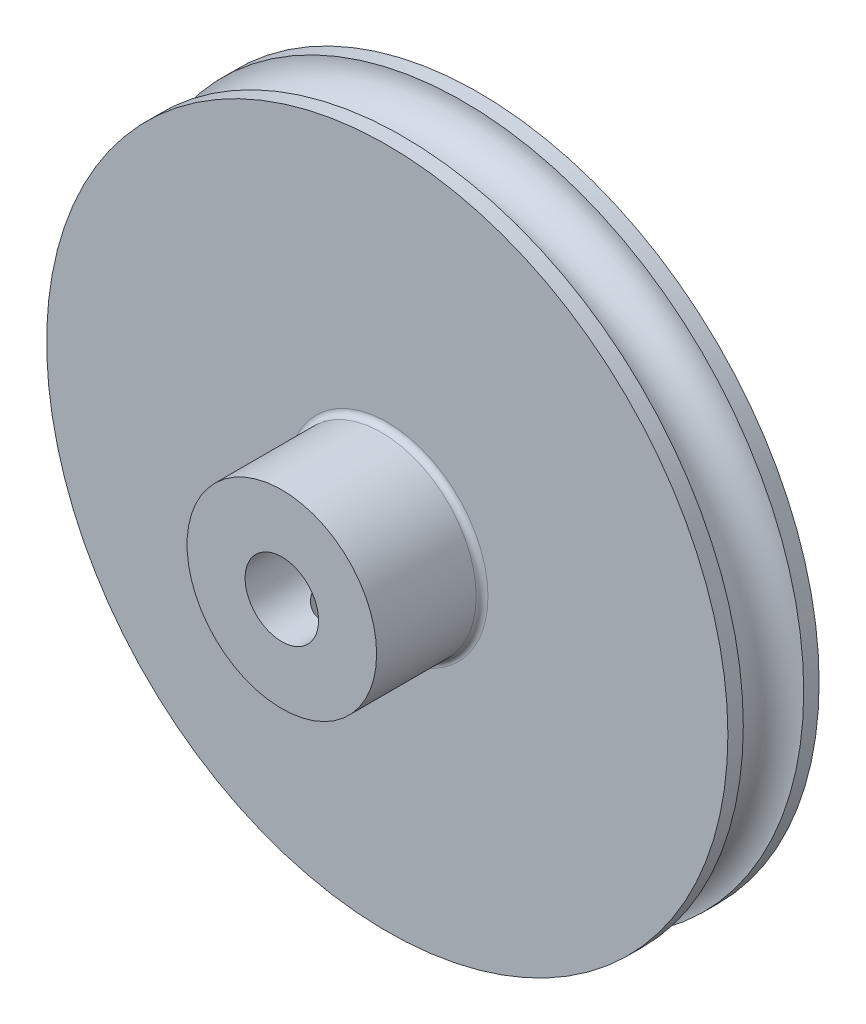
ISO-10303-21;
HEADER;
FILE_DESCRIPTION(('STEP AP214'),'2;1');
FILE_NAME('part.step','',(''),(''),'','','');
FILE_SCHEMA(('AUTOMOTIVE_DESIGN { 1 0 10303 214 1 1 1 1 }'));
ENDSEC;
DATA;
#1=APPLICATION_CONTEXT('core data for automotive mechanical design processes');
#2=APPLICATION_PROTOCOL_DEFINITION('international standard','automotive_design',2000,#1);
#3=PRODUCT_CONTEXT('',#1,'mechanical');
#4=PRODUCT('Part','Part','',(#3));
#5=PRODUCT_RELATED_PRODUCT_CATEGORY('part','',(#4));
#6=PRODUCT_DEFINITION_FORMATION('','',#4);
#7=PRODUCT_DEFINITION_CONTEXT('part definition',#1,'design');
#8=PRODUCT_DEFINITION('design','',#6,#7);
#9=PRODUCT_DEFINITION_SHAPE('','',#8);
#10=(LENGTH_UNIT() NAMED_UNIT(*) SI_UNIT(.MILLI.,.METRE.));
#11=(NAMED_UNIT(*) PLANE_ANGLE_UNIT() SI_UNIT($,.RADIAN.));
#12=(NAMED_UNIT(*) SI_UNIT($,.STERADIAN.) SOLID_ANGLE_UNIT());
#13=UNCERTAINTY_MEASURE_WITH_UNIT(LENGTH_MEASURE(1.E-05),#10,'distance_accuracy_value','');
#14=(GEOMETRIC_REPRESENTATION_CONTEXT(3) GLOBAL_UNCERTAINTY_ASSIGNED_CONTEXT((#13)) GLOBAL_UNIT_ASSIGNED_CONTEXT((#10,
#11,#12)) REPRESENTATION_CONTEXT('',''));
#15=CARTESIAN_POINT('',(0.,0.,0.));
#16=DIRECTION('',(0.,0.,1.));
#17=DIRECTION('',(1.,0.,0.));
#18=AXIS2_PLACEMENT_3D('',#15,#16,#17);
#19=CARTESIAN_POINT('',(0.,0.,3.85));
#20=DIRECTION('',(0.,0.,-1.));
#21=DIRECTION('',(-1.,0.,0.));
#22=AXIS2_PLACEMENT_3D('',#19,#20,#21);
#23=CYLINDRICAL_SURFACE('',#22,28.75);
#24=CARTESIAN_POINT('',(0.,0.,2.55));
#25=DIRECTION('',(0.,0.,-1.));
#26=DIRECTION('',(-1.,0.,0.));
#27=AXIS2_PLACEMENT_3D('',#24,#25,#26);
#28=CIRCLE('',#27,28.75);
#29=CARTESIAN_POINT('',(28.75,0.,2.55));
#30=VERTEX_POINT('',#29);
#31=EDGE_CURVE('E66',#30,#30,#28,.F.);
#32=ORIENTED_EDGE('',*,*,#31,.T.);
#33=EDGE_LOOP('',(#32));
#34=FACE_BOUND('',#33,.T.);
#35=CARTESIAN_POINT('',(0.,0.,3.85));
#36=DIRECTION('',(0.,0.,1.));
#37=DIRECTION('',(1.,0.,0.));
#38=AXIS2_PLACEMENT_3D('',#35,#36,#37);
#39=CIRCLE('',#38,28.75);
#40=CARTESIAN_POINT('',(28.75,0.,3.85));
#41=VERTEX_POINT('',#40);
#42=EDGE_CURVE('E74',#41,#41,#39,.T.);
#43=ORIENTED_EDGE('',*,*,#42,.F.);
#44=EDGE_LOOP('',(#43));
#45=FACE_BOUND('',#44,.T.);
#46=ADVANCED_FACE('F45',(#34,#45),#23,.T.);
#47=CARTESIAN_POINT('',(0.,0.,3.85));
#48=DIRECTION('',(0.,0.,1.));
#49=DIRECTION('',(1.,0.,0.));
#50=AXIS2_PLACEMENT_3D('',#47,#48,#49);
#51=PLANE('',#50);
#52=CARTESIAN_POINT('',(0.,0.,3.85));
#53=DIRECTION('',(0.,0.,1.));
#54=DIRECTION('',(1.,0.,0.));
#55=AXIS2_PLACEMENT_3D('',#52,#53,#54);
#56=CIRCLE('',#55,8.5);
#57=CARTESIAN_POINT('',(8.5,0.,3.85));
#58=VERTEX_POINT('',#57);
#59=EDGE_CURVE('E12',#58,#58,#56,.F.);
#60=ORIENTED_EDGE('',*,*,#59,.T.);
#61=EDGE_LOOP('',(#60));
#62=FACE_BOUND('',#61,.T.);
#63=ORIENTED_EDGE('',*,*,#42,.T.);
#64=EDGE_LOOP('',(#63));
#65=FACE_BOUND('',#64,.T.);
#66=ADVANCED_FACE('F126',(#62,#65),#51,.T.);
#67=CARTESIAN_POINT('',(0.,0.,0.));
#68=DIRECTION('',(0.,0.,1.));
#69=DIRECTION('',(1.,0.,0.));
#70=AXIS2_PLACEMENT_3D('',#67,#68,#69);
#71=TOROIDAL_SURFACE('',#70,28.75,2.55);
#72=CARTESIAN_POINT('',(28.75,0.,0.));
#73=DIRECTION('',(0.,1.,0.));
#74=DIRECTION('',(0.,0.,1.));
#75=AXIS2_PLACEMENT_3D('',#72,#73,#74);
#76=CIRCLE('',#75,2.55);
#77=CARTESIAN_POINT('',(28.75,0.,-2.55));
#78=VERTEX_POINT('',#77);
#79=EDGE_CURVE('E61',#78,#30,#76,.T.);
#80=ORIENTED_EDGE('',*,*,#79,.F.);
#81=CARTESIAN_POINT('',(0.,0.,-2.55));
#82=DIRECTION('',(0.,0.,1.));
#83=DIRECTION('',(1.,0.,0.));
#84=AXIS2_PLACEMENT_3D('',#81,#82,#83);
#85=CIRCLE('',#84,28.75);
#86=EDGE_CURVE('E64',#78,#78,#85,.F.);
#87=ORIENTED_EDGE('',*,*,#86,.F.);
#88=ORIENTED_EDGE('',*,*,#79,.T.);
#89=ORIENTED_EDGE('',*,*,#31,.F.);
#90=EDGE_LOOP('',(#80,#87,#88,#89));
#91=FACE_BOUND('',#90,.T.);
#92=ADVANCED_FACE('F62',(#91),#71,.F.);
#93=CARTESIAN_POINT('',(0.,0.,-3.85));
#94=DIRECTION('',(0.,0.,1.));
#95=DIRECTION('',(1.,0.,0.));
#96=AXIS2_PLACEMENT_3D('',#93,#94,#95);
#97=PLANE('',#96);
#98=CARTESIAN_POINT('',(0.,0.,-3.85));
#99=DIRECTION('',(0.,0.,1.));
#100=DIRECTION('',(1.,0.,0.));
#101=AXIS2_PLACEMENT_3D('',#98,#99,#100);
#102=CIRCLE('',#101,28.75);
#103=CARTESIAN_POINT('',(28.75,0.,-3.85));
#104=VERTEX_POINT('',#103);
#105=EDGE_CURVE('E68',#104,#104,#102,.T.);
#106=ORIENTED_EDGE('',*,*,#105,.F.);
#107=EDGE_LOOP('',(#106));
#108=FACE_BOUND('',#107,.T.);
#109=ADVANCED_FACE('F125',(#108),#97,.F.);
#110=ORIENTED_EDGE('',*,*,#86,.T.);
#111=EDGE_LOOP('',(#110));
#112=FACE_BOUND('',#111,.T.);
#113=ORIENTED_EDGE('',*,*,#105,.T.);
#114=EDGE_LOOP('',(#113));
#115=FACE_BOUND('',#114,.T.);
#116=ADVANCED_FACE('F121',(#112,#115),#23,.T.);
#117=CARTESIAN_POINT('',(0.,0.,12.75));
#118=DIRECTION('',(0.,0.,-1.));
#119=DIRECTION('',(-1.,0.,0.));
#120=AXIS2_PLACEMENT_3D('',#117,#118,#119);
#121=CYLINDRICAL_SURFACE('',#120,8.);
#122=CARTESIAN_POINT('',(0.,0.,4.35));
#123=DIRECTION('',(0.,0.,1.));
#124=DIRECTION('',(1.,0.,0.));
#125=AXIS2_PLACEMENT_3D('',#122,#123,#124);
#126=CIRCLE('',#125,8.);
#127=CARTESIAN_POINT('',(8.,0.,4.35));
#128=VERTEX_POINT('',#127);
#129=EDGE_CURVE('E54',#128,#128,#126,.T.);
#130=ORIENTED_EDGE('',*,*,#129,.T.);
#131=EDGE_LOOP('',(#130));
#132=FACE_BOUND('',#131,.T.);
#133=CARTESIAN_POINT('',(0.,-8.,9.5));
#134=CARTESIAN_POINT('',(0.110501451559641,-7.9999981315735,9.49999689901579));
#135=CARTESIAN_POINT('',(0.221037543774351,-7.99768770842435,9.49081126563495));
#136=CARTESIAN_POINT('',(0.438941765027377,-7.98869485106526,9.45436646492399));
#137=CARTESIAN_POINT('',(0.546308062494319,-7.98200993893301,9.42709705394953));
#138=CARTESIAN_POINT('',(0.754694496243435,-7.96500835109376,9.35541432871722));
#139=CARTESIAN_POINT('',(0.855722084573336,-7.95469603789411,9.31102160171297));
#140=CARTESIAN_POINT('',(1.04889617587257,-7.93153791743495,9.20642481327354));
#141=CARTESIAN_POINT('',(1.14104237913168,-7.91869202472209,9.14622021850805));
#142=CARTESIAN_POINT('',(1.31573590306789,-7.89156551455591,9.01039894712776));
#143=CARTESIAN_POINT('',(1.39807425341474,-7.87726276197502,8.93451790005459));
#144=CARTESIAN_POINT('',(1.54899856960443,-7.84898160157248,8.77006372678795));
#145=CARTESIAN_POINT('',(1.61758298259892,-7.83500323053157,8.68148916940408));
#146=CARTESIAN_POINT('',(1.74003539039863,-7.80873034264225,8.49253969768401));
#147=CARTESIAN_POINT('',(1.79366962123352,-7.79646392619748,8.39200902558836));
#148=CARTESIAN_POINT('',(1.88319587806766,-7.77532659757355,8.18300211778662));
#149=CARTESIAN_POINT('',(1.91909074058685,-7.76645514259225,8.07452715555731));
#150=CARTESIAN_POINT('',(1.97140644907302,-7.7533396892843,7.85500866906446));
#151=CARTESIAN_POINT('',(1.98820302444274,-7.74900654662681,7.74406013861601));
#152=CARTESIAN_POINT('',(2.00301570008854,-7.74519149946122,7.52084190800087));
#153=CARTESIAN_POINT('',(2.00103485575748,-7.74570880570571,7.40857242574382));
#154=CARTESIAN_POINT('',(1.97864869951961,-7.75145607355756,7.1887789230062));
#155=CARTESIAN_POINT('',(1.95869112025418,-7.75657150676391,7.08120583804623));
#156=CARTESIAN_POINT('',(1.90163224920399,-7.77075612894758,6.87098526545192));
#157=CARTESIAN_POINT('',(1.86452973609252,-7.77982559958985,6.76833812929477));
#158=CARTESIAN_POINT('',(1.77385263724958,-7.80100151874212,6.56968264499716));
#159=CARTESIAN_POINT('',(1.72011555631056,-7.81313769959755,6.47375177094724));
#160=CARTESIAN_POINT('',(1.59780836801993,-7.83906281127988,6.29210838699091));
#161=CARTESIAN_POINT('',(1.52923566507845,-7.85285203112837,6.20639766924367));
#162=CARTESIAN_POINT('',(1.37688456624163,-7.88101174053188,6.04506184574079));
#163=CARTESIAN_POINT('',(1.29272834422115,-7.89538759304001,5.96979401325153));
#164=CARTESIAN_POINT('',(1.11281589000493,-7.92274620771675,5.8343716767148));
#165=CARTESIAN_POINT('',(1.01705930361059,-7.93572892732543,5.77421763431525));
#166=CARTESIAN_POINT('',(0.816154518241855,-7.9589030945892,5.67059921836749));
#167=CARTESIAN_POINT('',(0.710975190944831,-7.96908480170303,5.62719287966076));
#168=CARTESIAN_POINT('',(0.49450134419051,-7.98543889321888,5.55877692572057));
#169=CARTESIAN_POINT('',(0.383207998867312,-7.99161204452374,5.53376379144248));
#170=CARTESIAN_POINT('',(0.160719960520035,-7.999139990285,5.50338991258822));
#171=CARTESIAN_POINT('',(0.0495956266509452,-8.00061404677705,5.4975426318996));
#172=CARTESIAN_POINT('',(-0.172043833068678,-7.99891739752601,5.50433200274065));
#173=CARTESIAN_POINT('',(-0.282559012859461,-7.99574710989128,5.51696699039884));
#174=CARTESIAN_POINT('',(-0.498152358368656,-7.98519441503143,5.55996121118851));
#175=CARTESIAN_POINT('',(-0.603286825291673,-7.97787512247748,5.59005501796932));
#176=CARTESIAN_POINT('',(-0.807009723270016,-7.95984942178845,5.66680944537126));
#177=CARTESIAN_POINT('',(-0.905597492043513,-7.94914267159856,5.71347173908423));
#178=CARTESIAN_POINT('',(-1.0953641792398,-7.92524410568414,5.82298150516631));
#179=CARTESIAN_POINT('',(-1.18638058911444,-7.91201156489243,5.88610148319569));
#180=CARTESIAN_POINT('',(-1.35670215152433,-7.88459345583226,6.02638654506263));
#181=CARTESIAN_POINT('',(-1.43600527863068,-7.87040772335606,6.10355405282254));
#182=CARTESIAN_POINT('',(-1.58265409076364,-7.84225275947695,6.27200261445929));
#183=CARTESIAN_POINT('',(-1.64965849016271,-7.82829738916375,6.36358360400323));
#184=CARTESIAN_POINT('',(-1.7673476786836,-7.80257171169652,6.55697684595429));
#185=CARTESIAN_POINT('',(-1.81803319221058,-7.79080130756035,6.65878864394634));
#186=CARTESIAN_POINT('',(-1.90126856081239,-7.77090792979553,6.86920762988411));
#187=CARTESIAN_POINT('',(-1.93392586220542,-7.76276340389207,6.97777017112535));
#188=CARTESIAN_POINT('',(-1.98046087993837,-7.75102325453578,7.19907951718548));
#189=CARTESIAN_POINT('',(-1.99434270330488,-7.74742663626581,7.31182540137666));
#190=CARTESIAN_POINT('',(-2.00271812044533,-7.74526534938609,7.53482803180694));
#191=CARTESIAN_POINT('',(-1.99775719704016,-7.74655910304352,7.64506324683298));
#192=CARTESIAN_POINT('',(-1.96983637108382,-7.7537054534379,7.86307185155731));
#193=CARTESIAN_POINT('',(-1.94687683024903,-7.75955795855809,7.97084529068487));
#194=CARTESIAN_POINT('',(-1.88390842592373,-7.77508347576963,8.18027794542055));
#195=CARTESIAN_POINT('',(-1.84400187290717,-7.78473353648412,8.28196974032028));
#196=CARTESIAN_POINT('',(-1.74835321814009,-7.80677007633105,8.47728717695159));
#197=CARTESIAN_POINT('',(-1.69260892004558,-7.81915693494364,8.57091169758256));
#198=CARTESIAN_POINT('',(-1.56515699818285,-7.8456751235135,8.75007283866936));
#199=CARTESIAN_POINT('',(-1.493070883883,-7.85984353109009,8.83533476456528));
#200=CARTESIAN_POINT('',(-1.33571916158631,-7.88810702995048,8.99272939306054));
#201=CARTESIAN_POINT('',(-1.25045042834819,-7.90220210302746,9.06485897348396));
#202=CARTESIAN_POINT('',(-1.06729011560345,-7.92903540863551,9.19521507808614));
#203=CARTESIAN_POINT('',(-0.969197896421848,-7.94174444487824,9.25316615156211));
#204=CARTESIAN_POINT('',(-0.764354746013967,-7.96406566633491,9.35166328392071));
#205=CARTESIAN_POINT('',(-0.657610084582319,-7.97368006933042,9.39222181419805));
#206=CARTESIAN_POINT('',(-0.459213670991295,-7.98730746087389,9.44876244043954));
#207=CARTESIAN_POINT('',(-0.368506894544092,-7.9920344673692,9.46793499073791));
#208=CARTESIAN_POINT('',(-0.185208095381711,-7.99838140309264,9.49355459149592));
#209=CARTESIAN_POINT('',(-0.0926162149901552,-8.00000156601192,9.50000259907373));
#210=CARTESIAN_POINT('',(0.,-8.,9.5));
#211=B_SPLINE_CURVE_WITH_KNOTS('',3,(#133,#134,#135,#136,#137,#138,#139,#140,#141,#142,#143,
#144,#145,#146,#147,#148,#149,#150,#151,#152,#153,#154,#155,#156,#157,#158,#159,#160,#161,#162,
#163,#164,#165,#166,#167,#168,#169,#170,#171,#172,#173,#174,#175,#176,#177,#178,#179,#180,#181,
#182,#183,#184,#185,#186,#187,#188,#189,#190,#191,#192,#193,#194,#195,#196,#197,#198,#199,#200,
#201,#202,#203,#204,#205,#206,#207,#208,#209,#210),.UNSPECIFIED.,.T.,.F.,(4,2,2,2,2,2,2,2,2,2,2,
2,2,2,2,2,2,2,2,2,2,2,2,2,2,2,2,2,2,2,2,2,2,2,2,2,2,2,4),(0.,0.331164949962519,
0.662517650351866,0.993473203048141,1.32443992022577,1.66152580582852,1.99864972773416,
2.34078196727742,2.68285948225824,3.01808393468093,3.3532538415469,3.68029996013785,
4.00736937959146,4.337740371696,4.66816921119311,5.00802001296453,5.34788119415424,
5.6889097201658,6.02987298255951,6.36211078603463,6.69431868154752,7.02160366023144,
7.34892169767482,7.68204783424897,8.01523150681786,8.35659345610396,8.69794025003772,
9.03723006156476,9.37644564340971,9.70591707202578,10.0353818794581,10.3628853408369,
10.6904342418696,11.0265276855097,11.3627009303165,11.7049624733721,12.0469781843289,
12.3245632392729,12.6021274139515),.UNSPECIFIED.);
#212=CARTESIAN_POINT('',(0.,-8.,9.5));
#213=VERTEX_POINT('',#212);
#214=EDGE_CURVE('E96',#213,#213,#211,.T.);
#215=ORIENTED_EDGE('',*,*,#214,.T.);
#216=EDGE_LOOP('',(#215));
#217=FACE_BOUND('',#216,.T.);
#218=CARTESIAN_POINT('',(0.,0.,12.75));
#219=DIRECTION('',(0.,0.,1.));
#220=DIRECTION('',(1.,0.,0.));
#221=AXIS2_PLACEMENT_3D('',#218,#219,#220);
#222=CIRCLE('',#221,8.);
#223=CARTESIAN_POINT('',(8.,0.,12.75));
#224=VERTEX_POINT('',#223);
#225=EDGE_CURVE('E69',#224,#224,#222,.T.);
#226=ORIENTED_EDGE('',*,*,#225,.F.);
#227=EDGE_LOOP('',(#226));
#228=FACE_BOUND('',#227,.T.);
#229=ADVANCED_FACE('F116',(#132,#217,#228),#121,.T.);
#230=CARTESIAN_POINT('',(0.,0.,12.75));
#231=DIRECTION('',(0.,0.,1.));
#232=DIRECTION('',(1.,0.,0.));
#233=AXIS2_PLACEMENT_3D('',#230,#231,#232);
#234=PLANE('',#233);
#235=CARTESIAN_POINT('',(0.,0.,12.75));
#236=DIRECTION('',(0.,0.,1.));
#237=DIRECTION('',(1.,0.,0.));
#238=AXIS2_PLACEMENT_3D('',#235,#236,#237);
#239=CIRCLE('',#238,3.1);
#240=CARTESIAN_POINT('',(3.1,0.,12.75));
#241=VERTEX_POINT('',#240);
#242=EDGE_CURVE('E115',#241,#241,#239,.T.);
#243=ORIENTED_EDGE('',*,*,#242,.F.);
#244=EDGE_LOOP('',(#243));
#245=FACE_BOUND('',#244,.T.);
#246=ORIENTED_EDGE('',*,*,#225,.T.);
#247=EDGE_LOOP('',(#246));
#248=FACE_BOUND('',#247,.T.);
#249=ADVANCED_FACE('F120',(#245,#248),#234,.T.);
#250=CARTESIAN_POINT('',(0.,0.,-12.6181240867132));
#251=DIRECTION('',(0.,0.,1.));
#252=DIRECTION('',(1.,0.,0.));
#253=AXIS2_PLACEMENT_3D('',#250,#251,#252);
#254=CYLINDRICAL_SURFACE('',#253,3.1);
#255=CARTESIAN_POINT('',(0.,-3.1,9.5));
#256=CARTESIAN_POINT('',(-0.101091385039777,-3.09999460939274,9.49999423985456));
#257=CARTESIAN_POINT('',(-0.202236134564494,-3.09500777365122,9.49228861003426));
#258=CARTESIAN_POINT('',(-0.40134422219677,-3.07554251080367,9.46191052513201));
#259=CARTESIAN_POINT('',(-0.499304337672782,-3.0610547651011,9.43922337585951));
#260=CARTESIAN_POINT('',(-0.688847609969658,-3.02403316266577,9.38023929755381));
#261=CARTESIAN_POINT('',(-0.780458562332545,-3.00153742435718,9.34400680467486));
#262=CARTESIAN_POINT('',(-0.955964244967446,-2.95033924070804,9.25944096599089));
#263=CARTESIAN_POINT('',(-1.03985843062382,-2.9216363577727,9.21110676699504));
#264=CARTESIAN_POINT('',(-1.20534975085783,-2.85755815418126,9.09934687867213));
#265=CARTESIAN_POINT('',(-1.28618869122808,-2.82182799524603,9.0350061395549));
#266=CARTESIAN_POINT('',(-1.43665631544782,-2.74828108070154,8.89520120954714));
#267=CARTESIAN_POINT('',(-1.50626924383573,-2.71046149080006,8.81972166508535));
#268=CARTESIAN_POINT('',(-1.64268679943019,-2.63034253686168,8.64691651791072));
#269=CARTESIAN_POINT('',(-1.70759476074744,-2.58819607847858,8.54801033709484));
#270=CARTESIAN_POINT('',(-1.81972592440112,-2.51062817225813,8.33825819113032));
#271=CARTESIAN_POINT('',(-1.86697956402236,-2.47519520238284,8.2274332037925));
#272=CARTESIAN_POINT('',(-1.93115046035712,-2.42525032881529,8.02768249145855));
#273=CARTESIAN_POINT('',(-1.95283049983355,-2.40766682164749,7.94106125555081));
#274=CARTESIAN_POINT('',(-1.98446592184547,-2.38166474413427,7.76441515405156));
#275=CARTESIAN_POINT('',(-1.99443957013961,-2.37323189735386,7.67439581776609));
#276=CARTESIAN_POINT('',(-2.00204983941226,-2.36681793758445,7.49315258210891));
#277=CARTESIAN_POINT('',(-1.99964615392167,-2.36887097141953,7.4019257134594));
#278=CARTESIAN_POINT('',(-1.98258006769263,-2.38316799120796,7.2214121827045));
#279=CARTESIAN_POINT('',(-1.96790747526994,-2.39542044970509,7.13212719699272));
#280=CARTESIAN_POINT('',(-1.92786567346179,-2.42774793365928,6.9607019055138));
#281=CARTESIAN_POINT('',(-1.9028579256027,-2.44755702424853,6.87842389978763));
#282=CARTESIAN_POINT('',(-1.84321796757953,-2.49277853296268,6.71910848586362));
#283=CARTESIAN_POINT('',(-1.80858257660194,-2.51819280237145,6.64207282013664));
#284=CARTESIAN_POINT('',(-1.72290696910724,-2.5777531470504,6.47940367147485));
#285=CARTESIAN_POINT('',(-1.66998346799092,-2.61263498659573,6.39503299514242));
#286=CARTESIAN_POINT('',(-1.55262072653794,-2.68404531595956,6.2354053931168));
#287=CARTESIAN_POINT('',(-1.48816769918918,-2.72057573761244,6.16015956168707));
#288=CARTESIAN_POINT('',(-1.33531850150805,-2.79921977867378,6.00641965469216));
#289=CARTESIAN_POINT('',(-1.2446991971314,-2.84108811643832,5.92998603795691));
#290=CARTESIAN_POINT('',(-1.04963410942446,-2.91877600894092,5.79342507092218));
#291=CARTESIAN_POINT('',(-0.945202988602563,-2.95460188779143,5.73328063171092));
#292=CARTESIAN_POINT('',(-0.746639365899209,-3.01014273026213,5.64204748666379));
#293=CARTESIAN_POINT('',(-0.65456737995395,-3.03164347825907,5.6075627187463));
#294=CARTESIAN_POINT('',(-0.464930213104867,-3.06644845105128,5.55229077747468));
#295=CARTESIAN_POINT('',(-0.367369568656605,-3.07975933933833,5.53149246748689));
#296=CARTESIAN_POINT('',(-0.169045410576032,-3.0969921575555,5.50463832866688));
#297=CARTESIAN_POINT('',(-0.0682718516736113,-3.10088094883133,5.49863453267088));
#298=CARTESIAN_POINT('',(0.132930127327373,-3.0987818893615,5.50188808806102));
#299=CARTESIAN_POINT('',(0.233358534619953,-3.09279367603535,5.51114599969775));
#300=CARTESIAN_POINT('',(0.425119290519885,-3.0721423509695,5.54342154508947));
#301=CARTESIAN_POINT('',(0.51664537144639,-3.05798682310753,5.56563483512585));
#302=CARTESIAN_POINT('',(0.694421792387248,-3.02258192723568,5.62210647387215));
#303=CARTESIAN_POINT('',(0.780671246170739,-3.00133137143629,5.65636683945258));
#304=CARTESIAN_POINT('',(0.952313130749649,-2.95155061853353,5.73852436888356));
#305=CARTESIAN_POINT('',(1.03719832856589,-2.92260695610669,5.78722473299525));
#306=CARTESIAN_POINT('',(1.19797699917457,-2.86047105425269,5.89554882406114));
#307=CARTESIAN_POINT('',(1.27386369806246,-2.82727565280704,5.95518069515739));
#308=CARTESIAN_POINT('',(1.42679573254823,-2.75363680286679,6.09411453626771));
#309=CARTESIAN_POINT('',(1.502217991591,-2.71286465557268,6.17503157595802));
#310=CARTESIAN_POINT('',(1.63901758369639,-2.63247341235496,6.34855184705935));
#311=CARTESIAN_POINT('',(1.70039095540679,-2.59285464439052,6.44115836314992));
#312=CARTESIAN_POINT('',(1.80081056775826,-2.5239466231388,6.62446981638804));
#313=CARTESIAN_POINT('',(1.84170928019883,-2.49398430191481,6.71390042775378));
#314=CARTESIAN_POINT('',(1.91037132253394,-2.44179234650511,6.8997766615712));
#315=CARTESIAN_POINT('',(1.93815244113827,-2.41955225114483,6.99621257806556));
#316=CARTESIAN_POINT('',(1.97925302886152,-2.38606269457456,7.19512500607156));
#317=CARTESIAN_POINT('',(1.99242553477726,-2.37492503520893,7.29765216173333));
#318=CARTESIAN_POINT('',(2.00265608987801,-2.36631138405995,7.50404792910151));
#319=CARTESIAN_POINT('',(1.99972843393145,-2.36882327321338,7.60791526916267));
#320=CARTESIAN_POINT('',(1.97974948336216,-2.385519162785,7.79704235785586));
#321=CARTESIAN_POINT('',(1.96492208911016,-2.39786312632663,7.88272249216542));
#322=CARTESIAN_POINT('',(1.92478575684782,-2.43019785844483,8.05010808712704));
#323=CARTESIAN_POINT('',(1.8994662269818,-2.45019635274102,8.13180943777216));
#324=CARTESIAN_POINT('',(1.8289643349275,-2.50348562062322,8.31720982840996));
#325=CARTESIAN_POINT('',(1.77994565236697,-2.53898245001553,8.41881180681012));
#326=CARTESIAN_POINT('',(1.66665742988777,-2.61474699558477,8.61119491391551));
#327=CARTESIAN_POINT('',(1.60236450988041,-2.65502197783671,8.70195913016394));
#328=CARTESIAN_POINT('',(1.45888519845899,-2.73652246794838,8.87267718655171));
#329=CARTESIAN_POINT('',(1.37951440481604,-2.77775351345464,8.95247350407429));
#330=CARTESIAN_POINT('',(1.20753038667599,-2.85671179204102,9.09829677390185));
#331=CARTESIAN_POINT('',(1.11492957876487,-2.89444225631806,9.16433649573719));
#332=CARTESIAN_POINT('',(0.930076713789365,-2.95860078482454,9.27341698597728));
#333=CARTESIAN_POINT('',(0.839194900302701,-2.98584930398292,9.318291150779));
#334=CARTESIAN_POINT('',(0.650002847052295,-3.03264637260129,9.39415954682018));
#335=CARTESIAN_POINT('',(0.551704291854859,-3.05220674429459,9.42517509888306));
#336=CARTESIAN_POINT('',(0.377584832422472,-3.07781554283967,9.46548062779998));
#337=CARTESIAN_POINT('',(0.30291009649643,-3.08609090810034,9.47838335273191));
#338=CARTESIAN_POINT('',(0.15216703635602,-3.09718531112089,9.49564543467788));
#339=CARTESIAN_POINT('',(0.0760986380390963,-3.10000405789149,9.50000433606902));
#340=CARTESIAN_POINT('',(0.,-3.1,9.5));
#341=B_SPLINE_CURVE_WITH_KNOTS('',3,(#255,#256,#257,#258,#259,#260,#261,#262,#263,#264,#265,
#266,#267,#268,#269,#270,#271,#272,#273,#274,#275,#276,#277,#278,#279,#280,#281,#282,#283,#284,
#285,#286,#287,#288,#289,#290,#291,#292,#293,#294,#295,#296,#297,#298,#299,#300,#301,#302,#303,
#304,#305,#306,#307,#308,#309,#310,#311,#312,#313,#314,#315,#316,#317,#318,#319,#320,#321,#322,
#323,#324,#325,#326,#327,#328,#329,#330,#331,#332,#333,#334,#335,#336,#337,#338,#339,#340),
.UNSPECIFIED.,.T.,.F.,(4,2,2,2,2,2,2,2,2,2,2,2,2,2,2,2,2,2,2,2,2,2,2,2,2,2,2,2,2,2,2,2,2,2,2,2,
2,2,2,2,2,2,4),(0.,0.302966311138187,0.606230220275506,0.908069468488516,1.20993000287647,
1.53665065809857,1.86382594121082,2.23880818267474,2.61314091205647,2.88505518621458,
3.15654461969954,3.42891870954099,3.70151928342565,3.96529957222992,4.22916711345738,
4.54461288083483,4.86043841114649,5.23578572642889,5.61073772744286,5.91138256881843,
6.21178247281048,6.51323739565213,6.814703385018,7.09919018653744,7.38372463832978,
7.68871147259943,7.99392645710977,8.34616896663427,8.69851067565524,9.00574516973998,
9.31256181935081,9.62243782101927,9.9320387371862,10.1943851218243,10.4569969939451,
10.8099170659531,11.1633808690887,11.521483908107,11.8792530427354,12.1928227029758,
12.5059082759399,12.7339602929413,12.9620244711131),.UNSPECIFIED.);
#342=CARTESIAN_POINT('',(0.,-3.1,9.5));
#343=VERTEX_POINT('',#342);
#344=EDGE_CURVE('E88',#343,#343,#341,.T.);
#345=ORIENTED_EDGE('',*,*,#344,.T.);
#346=EDGE_LOOP('',(#345));
#347=FACE_BOUND('',#346,.T.);
#348=CARTESIAN_POINT('',(0.,0.,-2.85));
#349=DIRECTION('',(0.,0.,1.));
#350=DIRECTION('',(1.,0.,0.));
#351=AXIS2_PLACEMENT_3D('',#348,#349,#350);
#352=CIRCLE('',#351,3.1);
#353=CARTESIAN_POINT('',(3.1,0.,-2.85));
#354=VERTEX_POINT('',#353);
#355=EDGE_CURVE('E77',#354,#354,#352,.F.);
#356=ORIENTED_EDGE('',*,*,#355,.T.);
#357=EDGE_LOOP('',(#356));
#358=FACE_BOUND('',#357,.T.);
#359=ORIENTED_EDGE('',*,*,#242,.T.);
#360=EDGE_LOOP('',(#359));
#361=FACE_BOUND('',#360,.T.);
#362=ADVANCED_FACE('F97',(#347,#358,#361),#254,.F.);
#363=CARTESIAN_POINT('',(0.,0.,-2.85));
#364=DIRECTION('',(0.,0.,1.));
#365=DIRECTION('',(1.,0.,0.));
#366=AXIS2_PLACEMENT_3D('',#363,#364,#365);
#367=PLANE('',#366);
#368=ORIENTED_EDGE('',*,*,#355,.F.);
#369=EDGE_LOOP('',(#368));
#370=FACE_BOUND('',#369,.T.);
#371=ADVANCED_FACE('F104',(#370),#367,.T.);
#372=CARTESIAN_POINT('',(0.,-28.75,7.5));
#373=DIRECTION('',(0.,1.,0.));
#374=DIRECTION('',(0.,0.,1.));
#375=AXIS2_PLACEMENT_3D('',#372,#373,#374);
#376=CYLINDRICAL_SURFACE('',#375,2.);
#377=ORIENTED_EDGE('',*,*,#344,.F.);
#378=EDGE_LOOP('',(#377));
#379=FACE_BOUND('',#378,.T.);
#380=ORIENTED_EDGE('',*,*,#214,.F.);
#381=EDGE_LOOP('',(#380));
#382=FACE_BOUND('',#381,.T.);
#383=ADVANCED_FACE('F101',(#379,#382),#376,.F.);
#384=CARTESIAN_POINT('',(0.,0.,4.35));
#385=DIRECTION('',(0.,0.,1.));
#386=DIRECTION('',(1.,0.,0.));
#387=AXIS2_PLACEMENT_3D('',#384,#385,#386);
#388=TOROIDAL_SURFACE('',#387,8.5,0.5);
#389=ORIENTED_EDGE('',*,*,#59,.F.);
#390=EDGE_LOOP('',(#389));
#391=FACE_BOUND('',#390,.T.);
#392=ORIENTED_EDGE('',*,*,#129,.F.);
#393=EDGE_LOOP('',(#392));
#394=FACE_BOUND('',#393,.T.);
#395=ADVANCED_FACE('F47',(#391,#394),#388,.F.);
#396=CLOSED_SHELL('',(#46,#66,#92,#109,#116,#229,#249,#362,#371,#383,#395));
#397=MANIFOLD_SOLID_BREP('B2',#396);
#398=ADVANCED_BREP_SHAPE_REPRESENTATION('',(#18,#397),#14);
#399=SHAPE_DEFINITION_REPRESENTATION(#9,#398);
ENDSEC;
END-ISO-10303-21;
